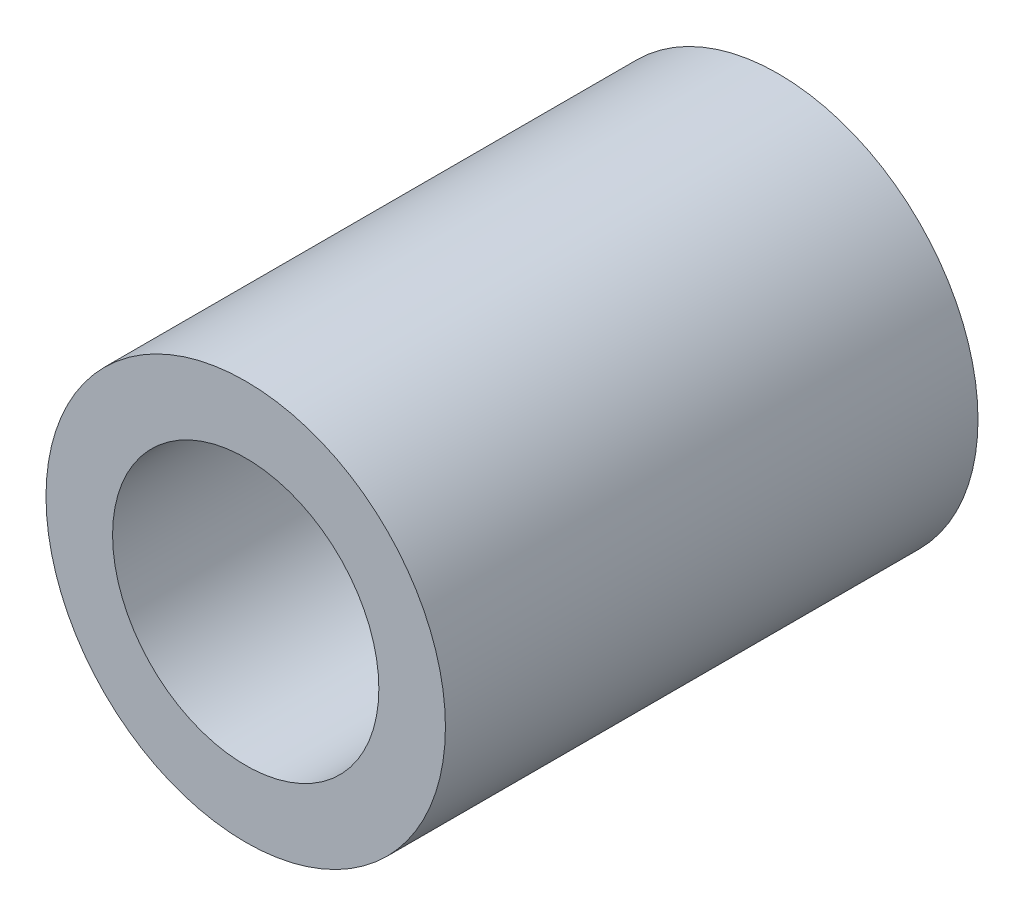
ISO-10303-21;
HEADER;
FILE_DESCRIPTION(('STEP AP214'),'2;1');
FILE_NAME('part.step','',(''),(''),'','','');
FILE_SCHEMA(('AUTOMOTIVE_DESIGN { 1 0 10303 214 1 1 1 1 }'));
ENDSEC;
DATA;
#1=APPLICATION_CONTEXT('core data for automotive mechanical design processes');
#2=APPLICATION_PROTOCOL_DEFINITION('international standard','automotive_design',2000,#1);
#3=PRODUCT_CONTEXT('',#1,'mechanical');
#4=PRODUCT('Part','Part','',(#3));
#5=PRODUCT_RELATED_PRODUCT_CATEGORY('part','',(#4));
#6=PRODUCT_DEFINITION_FORMATION('','',#4);
#7=PRODUCT_DEFINITION_CONTEXT('part definition',#1,'design');
#8=PRODUCT_DEFINITION('design','',#6,#7);
#9=PRODUCT_DEFINITION_SHAPE('','',#8);
#10=(LENGTH_UNIT() NAMED_UNIT(*) SI_UNIT(.MILLI.,.METRE.));
#11=(NAMED_UNIT(*) PLANE_ANGLE_UNIT() SI_UNIT($,.RADIAN.));
#12=(NAMED_UNIT(*) SI_UNIT($,.STERADIAN.) SOLID_ANGLE_UNIT());
#13=UNCERTAINTY_MEASURE_WITH_UNIT(LENGTH_MEASURE(1.E-05),#10,'distance_accuracy_value','');
#14=(GEOMETRIC_REPRESENTATION_CONTEXT(3) GLOBAL_UNCERTAINTY_ASSIGNED_CONTEXT((#13)) GLOBAL_UNIT_ASSIGNED_CONTEXT((#10,
#11,#12)) REPRESENTATION_CONTEXT('',''));
#15=CARTESIAN_POINT('',(0.,0.,0.));
#16=DIRECTION('',(0.,0.,1.));
#17=DIRECTION('',(1.,0.,0.));
#18=AXIS2_PLACEMENT_3D('',#15,#16,#17);
#19=CARTESIAN_POINT('',(135.,20.,-15.4852813742386));
#20=DIRECTION('',(0.,0.,1.));
#21=DIRECTION('',(1.,0.,0.));
#22=AXIS2_PLACEMENT_3D('',#19,#20,#21);
#23=CYLINDRICAL_SURFACE('',#22,2.99999999999999);
#24=CARTESIAN_POINT('',(135.,20.,-7.));
#25=DIRECTION('',(0.,0.,1.));
#26=DIRECTION('',(1.,0.,0.));
#27=AXIS2_PLACEMENT_3D('',#24,#25,#26);
#28=CIRCLE('',#27,2.99999999999999);
#29=CARTESIAN_POINT('',(138.,20.,-7.));
#30=VERTEX_POINT('',#29);
#31=EDGE_CURVE('E37',#30,#30,#28,.F.);
#32=ORIENTED_EDGE('',*,*,#31,.F.);
#33=EDGE_LOOP('',(#32));
#34=FACE_BOUND('',#33,.T.);
#35=CARTESIAN_POINT('',(135.,20.,0.99999999999999));
#36=DIRECTION('',(0.,0.,1.));
#37=DIRECTION('',(1.,0.,0.));
#38=AXIS2_PLACEMENT_3D('',#35,#36,#37);
#39=CIRCLE('',#38,2.99999999999999);
#40=CARTESIAN_POINT('',(138.,20.,0.99999999999999));
#41=VERTEX_POINT('',#40);
#42=EDGE_CURVE('E41',#41,#41,#39,.T.);
#43=ORIENTED_EDGE('',*,*,#42,.F.);
#44=EDGE_LOOP('',(#43));
#45=FACE_BOUND('',#44,.T.);
#46=ADVANCED_FACE('F31',(#34,#45),#23,.T.);
#47=CARTESIAN_POINT('',(135.,20.,0.99999999999999));
#48=DIRECTION('',(0.,0.,1.));
#49=DIRECTION('',(1.,0.,0.));
#50=AXIS2_PLACEMENT_3D('',#47,#48,#49);
#51=PLANE('',#50);
#52=CARTESIAN_POINT('',(135.,20.,0.99999999999999));
#53=DIRECTION('',(0.,0.,1.));
#54=DIRECTION('',(1.,0.,0.));
#55=AXIS2_PLACEMENT_3D('',#52,#53,#54);
#56=CIRCLE('',#55,2.);
#57=CARTESIAN_POINT('',(137.,20.,0.99999999999999));
#58=VERTEX_POINT('',#57);
#59=EDGE_CURVE('E46',#58,#58,#56,.T.);
#60=ORIENTED_EDGE('',*,*,#59,.F.);
#61=EDGE_LOOP('',(#60));
#62=FACE_BOUND('',#61,.T.);
#63=ORIENTED_EDGE('',*,*,#42,.T.);
#64=EDGE_LOOP('',(#63));
#65=FACE_BOUND('',#64,.T.);
#66=ADVANCED_FACE('F53',(#62,#65),#51,.T.);
#67=CARTESIAN_POINT('',(135.,20.,-15.4852813742386));
#68=DIRECTION('',(0.,0.,1.));
#69=DIRECTION('',(1.,0.,0.));
#70=AXIS2_PLACEMENT_3D('',#67,#68,#69);
#71=CYLINDRICAL_SURFACE('',#70,2.);
#72=CARTESIAN_POINT('',(135.,20.,-7.));
#73=DIRECTION('',(0.,0.,1.));
#74=DIRECTION('',(1.,0.,0.));
#75=AXIS2_PLACEMENT_3D('',#72,#73,#74);
#76=CIRCLE('',#75,2.);
#77=CARTESIAN_POINT('',(137.,20.,-7.));
#78=VERTEX_POINT('',#77);
#79=EDGE_CURVE('E10',#78,#78,#76,.F.);
#80=ORIENTED_EDGE('',*,*,#79,.T.);
#81=EDGE_LOOP('',(#80));
#82=FACE_BOUND('',#81,.T.);
#83=ORIENTED_EDGE('',*,*,#59,.T.);
#84=EDGE_LOOP('',(#83));
#85=FACE_BOUND('',#84,.T.);
#86=ADVANCED_FACE('F51',(#82,#85),#71,.F.);
#87=CARTESIAN_POINT('',(135.,20.,-7.));
#88=DIRECTION('',(0.,0.,1.));
#89=DIRECTION('',(1.,0.,0.));
#90=AXIS2_PLACEMENT_3D('',#87,#88,#89);
#91=PLANE('',#90);
#92=ORIENTED_EDGE('',*,*,#31,.T.);
#93=EDGE_LOOP('',(#92));
#94=FACE_BOUND('',#93,.T.);
#95=ORIENTED_EDGE('',*,*,#79,.F.);
#96=EDGE_LOOP('',(#95));
#97=FACE_BOUND('',#96,.T.);
#98=ADVANCED_FACE('F72',(#94,#97),#91,.F.);
#99=CLOSED_SHELL('',(#46,#66,#86,#98));
#100=MANIFOLD_SOLID_BREP('B2',#99);
#101=ADVANCED_BREP_SHAPE_REPRESENTATION('',(#18,#100),#14);
#102=SHAPE_DEFINITION_REPRESENTATION(#9,#101);
ENDSEC;
END-ISO-10303-21;
